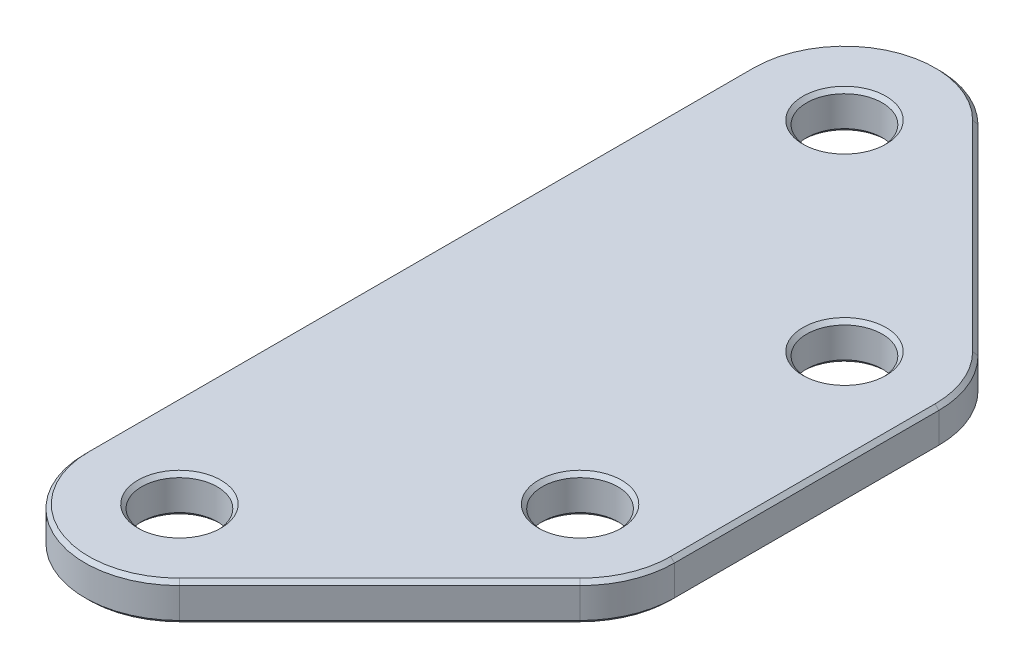
ISO-10303-21;
HEADER;
FILE_DESCRIPTION(('STEP AP214'),'2;1');
FILE_NAME('part.step','',(''),(''),'','','');
FILE_SCHEMA(('AUTOMOTIVE_DESIGN { 1 0 10303 214 1 1 1 1 }'));
ENDSEC;
DATA;
#1=APPLICATION_CONTEXT('core data for automotive mechanical design processes');
#2=APPLICATION_PROTOCOL_DEFINITION('international standard','automotive_design',2000,#1);
#3=PRODUCT_CONTEXT('',#1,'mechanical');
#4=PRODUCT('Part','Part','',(#3));
#5=PRODUCT_RELATED_PRODUCT_CATEGORY('part','',(#4));
#6=PRODUCT_DEFINITION_FORMATION('','',#4);
#7=PRODUCT_DEFINITION_CONTEXT('part definition',#1,'design');
#8=PRODUCT_DEFINITION('design','',#6,#7);
#9=PRODUCT_DEFINITION_SHAPE('','',#8);
#10=(LENGTH_UNIT() NAMED_UNIT(*) SI_UNIT(.MILLI.,.METRE.));
#11=(NAMED_UNIT(*) PLANE_ANGLE_UNIT() SI_UNIT($,.RADIAN.));
#12=(NAMED_UNIT(*) SI_UNIT($,.STERADIAN.) SOLID_ANGLE_UNIT());
#13=UNCERTAINTY_MEASURE_WITH_UNIT(LENGTH_MEASURE(1.E-05),#10,'distance_accuracy_value','');
#14=(GEOMETRIC_REPRESENTATION_CONTEXT(3) GLOBAL_UNCERTAINTY_ASSIGNED_CONTEXT((#13)) GLOBAL_UNIT_ASSIGNED_CONTEXT((#10,
#11,#12)) REPRESENTATION_CONTEXT('',''));
#15=CARTESIAN_POINT('',(0.,0.,0.));
#16=DIRECTION('',(0.,0.,1.));
#17=DIRECTION('',(1.,0.,0.));
#18=AXIS2_PLACEMENT_3D('',#15,#16,#17);
#19=CARTESIAN_POINT('',(-50.,20.,176.066017177983));
#20=DIRECTION('',(0.,1.,0.));
#21=DIRECTION('',(0.,0.,1.));
#22=AXIS2_PLACEMENT_3D('',#19,#20,#21);
#23=PLANE('',#22);
#24=CARTESIAN_POINT('',(-50.,20.,176.066017177982));
#25=DIRECTION('',(0.,1.,0.));
#26=DIRECTION('',(0.,0.,1.));
#27=AXIS2_PLACEMENT_3D('',#24,#25,#26);
#28=CIRCLE('',#27,22.0000000000001);
#29=CARTESIAN_POINT('',(-50.,20.,198.066017177982));
#30=VERTEX_POINT('',#29);
#31=EDGE_CURVE('E11',#30,#30,#28,.F.);
#32=ORIENTED_EDGE('',*,*,#31,.T.);
#33=EDGE_LOOP('',(#32));
#34=FACE_BOUND('',#33,.T.);
#35=CARTESIAN_POINT('',(56.0660171779823,20.,-70.));
#36=DIRECTION('',(0.,1.,0.));
#37=DIRECTION('',(0.,0.,1.));
#38=AXIS2_PLACEMENT_3D('',#35,#36,#37);
#39=CIRCLE('',#38,22.0000000000001);
#40=CARTESIAN_POINT('',(56.0660171779823,20.,-47.9999999999999));
#41=VERTEX_POINT('',#40);
#42=EDGE_CURVE('E50',#41,#41,#39,.F.);
#43=ORIENTED_EDGE('',*,*,#42,.T.);
#44=EDGE_LOOP('',(#43));
#45=FACE_BOUND('',#44,.T.);
#46=CARTESIAN_POINT('',(-50.0000000000001,20.,-176.066017177982));
#47=DIRECTION('',(0.,1.,0.));
#48=DIRECTION('',(0.,0.,1.));
#49=AXIS2_PLACEMENT_3D('',#46,#47,#48);
#50=CIRCLE('',#49,48.0000000000001);
#51=CARTESIAN_POINT('',(-16.0588745030458,20.,-210.007142674936));
#52=VERTEX_POINT('',#51);
#53=CARTESIAN_POINT('',(-98.0000000000002,20.,-176.066017177982));
#54=VERTEX_POINT('',#53);
#55=EDGE_CURVE('E58',#52,#54,#50,.T.);
#56=ORIENTED_EDGE('',*,*,#55,.T.);
#57=DIRECTION('',(0.,0.,1.));
#58=VECTOR('',#57,1.);
#59=CARTESIAN_POINT('',(-98.0000000000001,20.,176.066017177983));
#60=LINE('',#59,#58);
#61=CARTESIAN_POINT('',(-98.0000000000001,20.,176.066017177983));
#62=VERTEX_POINT('',#61);
#63=EDGE_CURVE('E274',#54,#62,#60,.T.);
#64=ORIENTED_EDGE('',*,*,#63,.T.);
#65=CARTESIAN_POINT('',(-50.,20.,176.066017177983));
#66=DIRECTION('',(0.,1.,0.));
#67=DIRECTION('',(0.,0.,1.));
#68=AXIS2_PLACEMENT_3D('',#65,#66,#67);
#69=CIRCLE('',#68,48.0000000000001);
#70=CARTESIAN_POINT('',(-16.0588745030457,20.,210.007142674937));
#71=VERTEX_POINT('',#70);
#72=EDGE_CURVE('E262',#62,#71,#69,.T.);
#73=ORIENTED_EDGE('',*,*,#72,.T.);
#74=DIRECTION('',(0.707106781186548,0.,-0.707106781186547));
#75=VECTOR('',#74,1.);
#76=CARTESIAN_POINT('',(90.0071426749366,20.,103.941125496955));
#77=LINE('',#76,#75);
#78=CARTESIAN_POINT('',(90.0071426749366,20.,103.941125496955));
#79=VERTEX_POINT('',#78);
#80=EDGE_CURVE('E264',#71,#79,#77,.T.);
#81=ORIENTED_EDGE('',*,*,#80,.T.);
#82=CARTESIAN_POINT('',(56.0660171779823,20.,70.0000000000003));
#83=DIRECTION('',(0.,1.,0.));
#84=DIRECTION('',(0.,0.,1.));
#85=AXIS2_PLACEMENT_3D('',#82,#83,#84);
#86=CIRCLE('',#85,48.0000000000001);
#87=CARTESIAN_POINT('',(104.066017177982,20.,70.0000000000003));
#88=VERTEX_POINT('',#87);
#89=EDGE_CURVE('E266',#79,#88,#86,.T.);
#90=ORIENTED_EDGE('',*,*,#89,.T.);
#91=DIRECTION('',(0.,0.,-1.));
#92=VECTOR('',#91,1.);
#93=CARTESIAN_POINT('',(104.066017177982,20.,-69.9999999999998));
#94=LINE('',#93,#92);
#95=CARTESIAN_POINT('',(104.066017177982,20.,-69.9999999999998));
#96=VERTEX_POINT('',#95);
#97=EDGE_CURVE('E268',#88,#96,#94,.T.);
#98=ORIENTED_EDGE('',*,*,#97,.T.);
#99=CARTESIAN_POINT('',(56.0660171779823,20.,-69.9999999999998));
#100=DIRECTION('',(0.,1.,0.));
#101=DIRECTION('',(0.,0.,1.));
#102=AXIS2_PLACEMENT_3D('',#99,#100,#101);
#103=CIRCLE('',#102,48.0000000000001);
#104=CARTESIAN_POINT('',(90.0071426749365,20.,-103.941125496954));
#105=VERTEX_POINT('',#104);
#106=EDGE_CURVE('E270',#96,#105,#103,.T.);
#107=ORIENTED_EDGE('',*,*,#106,.T.);
#108=DIRECTION('',(-0.707106781186549,0.,-0.707106781186546));
#109=VECTOR('',#108,1.);
#110=CARTESIAN_POINT('',(-16.0588745030458,20.,-210.007142674936));
#111=LINE('',#110,#109);
#112=EDGE_CURVE('E63',#105,#52,#111,.T.);
#113=ORIENTED_EDGE('',*,*,#112,.T.);
#114=EDGE_LOOP('',(#56,#64,#73,#81,#90,#98,#107,#113));
#115=FACE_BOUND('',#114,.T.);
#116=CARTESIAN_POINT('',(-50.0000000000001,20.,-176.066017177982));
#117=DIRECTION('',(0.,1.,0.));
#118=DIRECTION('',(0.,0.,1.));
#119=AXIS2_PLACEMENT_3D('',#116,#117,#118);
#120=CIRCLE('',#119,22.0000000000001);
#121=CARTESIAN_POINT('',(-50.0000000000001,20.,-154.066017177982));
#122=VERTEX_POINT('',#121);
#123=EDGE_CURVE('E259',#122,#122,#120,.F.);
#124=ORIENTED_EDGE('',*,*,#123,.T.);
#125=EDGE_LOOP('',(#124));
#126=FACE_BOUND('',#125,.T.);
#127=CARTESIAN_POINT('',(56.0660171779823,20.,70.));
#128=DIRECTION('',(0.,1.,0.));
#129=DIRECTION('',(0.,0.,1.));
#130=AXIS2_PLACEMENT_3D('',#127,#128,#129);
#131=CIRCLE('',#130,22.0000000000001);
#132=CARTESIAN_POINT('',(56.0660171779823,20.,92.0000000000001));
#133=VERTEX_POINT('',#132);
#134=EDGE_CURVE('E256',#133,#133,#131,.F.);
#135=ORIENTED_EDGE('',*,*,#134,.T.);
#136=EDGE_LOOP('',(#135));
#137=FACE_BOUND('',#136,.T.);
#138=ADVANCED_FACE('F40',(#34,#45,#115,#126,#137),#23,.T.);
#139=CARTESIAN_POINT('',(-50.,0.,176.066017177983));
#140=DIRECTION('',(0.,1.,0.));
#141=DIRECTION('',(0.,0.,1.));
#142=AXIS2_PLACEMENT_3D('',#139,#140,#141);
#143=PLANE('',#142);
#144=CARTESIAN_POINT('',(-50.,0.,176.066017177982));
#145=DIRECTION('',(0.,1.,0.));
#146=DIRECTION('',(0.,0.,1.));
#147=AXIS2_PLACEMENT_3D('',#144,#145,#146);
#148=CIRCLE('',#147,22.);
#149=CARTESIAN_POINT('',(-50.,0.,198.066017177982));
#150=VERTEX_POINT('',#149);
#151=EDGE_CURVE('E197',#150,#150,#148,.T.);
#152=ORIENTED_EDGE('',*,*,#151,.T.);
#153=EDGE_LOOP('',(#152));
#154=FACE_BOUND('',#153,.T.);
#155=CARTESIAN_POINT('',(56.0660171779823,0.,70.));
#156=DIRECTION('',(0.,1.,0.));
#157=DIRECTION('',(0.,0.,1.));
#158=AXIS2_PLACEMENT_3D('',#155,#156,#157);
#159=CIRCLE('',#158,22.);
#160=CARTESIAN_POINT('',(56.0660171779823,0.,92.));
#161=VERTEX_POINT('',#160);
#162=EDGE_CURVE('E194',#161,#161,#159,.T.);
#163=ORIENTED_EDGE('',*,*,#162,.T.);
#164=EDGE_LOOP('',(#163));
#165=FACE_BOUND('',#164,.T.);
#166=CARTESIAN_POINT('',(56.0660171779823,0.,-70.));
#167=DIRECTION('',(0.,1.,0.));
#168=DIRECTION('',(0.,0.,1.));
#169=AXIS2_PLACEMENT_3D('',#166,#167,#168);
#170=CIRCLE('',#169,22.);
#171=CARTESIAN_POINT('',(56.0660171779823,0.,-48.));
#172=VERTEX_POINT('',#171);
#173=EDGE_CURVE('E186',#172,#172,#170,.T.);
#174=ORIENTED_EDGE('',*,*,#173,.T.);
#175=EDGE_LOOP('',(#174));
#176=FACE_BOUND('',#175,.T.);
#177=CARTESIAN_POINT('',(-50.0000000000001,0.,-176.066017177982));
#178=DIRECTION('',(0.,1.,0.));
#179=DIRECTION('',(0.,0.,1.));
#180=AXIS2_PLACEMENT_3D('',#177,#178,#179);
#181=CIRCLE('',#180,22.);
#182=CARTESIAN_POINT('',(-50.0000000000001,0.,-154.066017177982));
#183=VERTEX_POINT('',#182);
#184=EDGE_CURVE('E183',#183,#183,#181,.T.);
#185=ORIENTED_EDGE('',*,*,#184,.T.);
#186=EDGE_LOOP('',(#185));
#187=FACE_BOUND('',#186,.T.);
#188=CARTESIAN_POINT('',(56.0660171779823,0.,70.0000000000003));
#189=DIRECTION('',(0.,1.,0.));
#190=DIRECTION('',(0.,0.,1.));
#191=AXIS2_PLACEMENT_3D('',#188,#189,#190);
#192=CIRCLE('',#191,48.);
#193=CARTESIAN_POINT('',(104.066017177982,0.,70.0000000000003));
#194=VERTEX_POINT('',#193);
#195=CARTESIAN_POINT('',(90.0071426749365,0.,103.941125496955));
#196=VERTEX_POINT('',#195);
#197=EDGE_CURVE('E182',#194,#196,#192,.F.);
#198=ORIENTED_EDGE('',*,*,#197,.T.);
#199=DIRECTION('',(-0.707106781186548,0.,0.707106781186547));
#200=VECTOR('',#199,1.);
#201=CARTESIAN_POINT('',(-16.0588745030457,0.,210.007142674937));
#202=LINE('',#201,#200);
#203=CARTESIAN_POINT('',(-16.0588745030457,0.,210.007142674937));
#204=VERTEX_POINT('',#203);
#205=EDGE_CURVE('E161',#196,#204,#202,.T.);
#206=ORIENTED_EDGE('',*,*,#205,.T.);
#207=CARTESIAN_POINT('',(-50.,0.,176.066017177983));
#208=DIRECTION('',(0.,1.,0.));
#209=DIRECTION('',(0.,0.,1.));
#210=AXIS2_PLACEMENT_3D('',#207,#208,#209);
#211=CIRCLE('',#210,48.);
#212=CARTESIAN_POINT('',(-98.,0.,176.066017177983));
#213=VERTEX_POINT('',#212);
#214=EDGE_CURVE('E171',#204,#213,#211,.F.);
#215=ORIENTED_EDGE('',*,*,#214,.T.);
#216=DIRECTION('',(0.,0.,-1.));
#217=VECTOR('',#216,1.);
#218=CARTESIAN_POINT('',(-98.,0.,176.066017177983));
#219=LINE('',#218,#217);
#220=CARTESIAN_POINT('',(-98.,0.,-176.066017177982));
#221=VERTEX_POINT('',#220);
#222=EDGE_CURVE('E177',#213,#221,#219,.T.);
#223=ORIENTED_EDGE('',*,*,#222,.T.);
#224=CARTESIAN_POINT('',(-50.0000000000001,0.,-176.066017177982));
#225=DIRECTION('',(0.,1.,0.));
#226=DIRECTION('',(0.,0.,1.));
#227=AXIS2_PLACEMENT_3D('',#224,#225,#226);
#228=CIRCLE('',#227,48.);
#229=CARTESIAN_POINT('',(-16.0588745030459,0.,-210.007142674936));
#230=VERTEX_POINT('',#229);
#231=EDGE_CURVE('E351',#221,#230,#228,.F.);
#232=ORIENTED_EDGE('',*,*,#231,.T.);
#233=DIRECTION('',(0.707106781186549,0.,0.707106781186546));
#234=VECTOR('',#233,1.);
#235=CARTESIAN_POINT('',(160.007142674936,0.,-33.9411254969546));
#236=LINE('',#235,#234);
#237=CARTESIAN_POINT('',(90.0071426749364,0.,-103.941125496954));
#238=VERTEX_POINT('',#237);
#239=EDGE_CURVE('E353',#230,#238,#236,.T.);
#240=ORIENTED_EDGE('',*,*,#239,.T.);
#241=CARTESIAN_POINT('',(56.0660171779823,0.,-69.9999999999998));
#242=DIRECTION('',(0.,1.,0.));
#243=DIRECTION('',(0.,0.,1.));
#244=AXIS2_PLACEMENT_3D('',#241,#242,#243);
#245=CIRCLE('',#244,48.);
#246=CARTESIAN_POINT('',(104.066017177982,0.,-69.9999999999998));
#247=VERTEX_POINT('',#246);
#248=EDGE_CURVE('E355',#238,#247,#245,.F.);
#249=ORIENTED_EDGE('',*,*,#248,.T.);
#250=DIRECTION('',(0.,0.,1.));
#251=VECTOR('',#250,1.);
#252=CARTESIAN_POINT('',(104.066017177982,0.,176.066017177982));
#253=LINE('',#252,#251);
#254=EDGE_CURVE('E188',#247,#194,#253,.T.);
#255=ORIENTED_EDGE('',*,*,#254,.T.);
#256=EDGE_LOOP('',(#198,#206,#215,#223,#232,#240,#249,#255));
#257=FACE_BOUND('',#256,.T.);
#258=ADVANCED_FACE('F180',(#154,#165,#176,#187,#257),#143,.F.);
#259=CARTESIAN_POINT('',(-50.,20.,176.066017177983));
#260=DIRECTION('',(0.,-1.,0.));
#261=DIRECTION('',(0.,0.,-1.));
#262=AXIS2_PLACEMENT_3D('',#259,#260,#261);
#263=CYLINDRICAL_SURFACE('',#262,50.);
#264=DIRECTION('',(0.,-1.,0.));
#265=VECTOR('',#264,1.);
#266=CARTESIAN_POINT('',(-100.,20.,176.066017177983));
#267=LINE('',#266,#265);
#268=CARTESIAN_POINT('',(-100.,18.0000000000001,176.066017177983));
#269=VERTEX_POINT('',#268);
#270=CARTESIAN_POINT('',(-100.,2.00000000000002,176.066017177983));
#271=VERTEX_POINT('',#270);
#272=EDGE_CURVE('E294',#269,#271,#267,.T.);
#273=ORIENTED_EDGE('',*,*,#272,.T.);
#274=CARTESIAN_POINT('',(-50.,2.00000000000002,176.066017177983));
#275=DIRECTION('',(0.,1.,0.));
#276=DIRECTION('',(0.,0.,1.));
#277=AXIS2_PLACEMENT_3D('',#274,#275,#276);
#278=CIRCLE('',#277,50.);
#279=CARTESIAN_POINT('',(-14.6446609406726,2.00000000000002,211.42135623731));
#280=VERTEX_POINT('',#279);
#281=EDGE_CURVE('E254',#271,#280,#278,.T.);
#282=ORIENTED_EDGE('',*,*,#281,.T.);
#283=DIRECTION('',(0.,-1.,0.));
#284=VECTOR('',#283,1.);
#285=CARTESIAN_POINT('',(-14.6446609406726,20.,211.42135623731));
#286=LINE('',#285,#284);
#287=CARTESIAN_POINT('',(-14.6446609406726,18.0000000000001,211.42135623731));
#288=VERTEX_POINT('',#287);
#289=EDGE_CURVE('E178',#288,#280,#286,.T.);
#290=ORIENTED_EDGE('',*,*,#289,.F.);
#291=CARTESIAN_POINT('',(-50.,18.0000000000001,176.066017177983));
#292=DIRECTION('',(0.,1.,0.));
#293=DIRECTION('',(0.,0.,1.));
#294=AXIS2_PLACEMENT_3D('',#291,#292,#293);
#295=CIRCLE('',#294,50.);
#296=EDGE_CURVE('E252',#288,#269,#295,.F.);
#297=ORIENTED_EDGE('',*,*,#296,.T.);
#298=EDGE_LOOP('',(#273,#282,#290,#297));
#299=FACE_BOUND('',#298,.T.);
#300=ADVANCED_FACE('F372',(#299),#263,.T.);
#301=CARTESIAN_POINT('',(-14.6446609406726,20.,211.42135623731));
#302=DIRECTION('',(-0.707106781186547,0.,-0.707106781186548));
#303=DIRECTION('',(-0.707106781186548,0.,0.707106781186547));
#304=AXIS2_PLACEMENT_3D('',#301,#302,#303);
#305=PLANE('',#304);
#306=ORIENTED_EDGE('',*,*,#289,.T.);
#307=DIRECTION('',(0.707106781186548,0.,-0.707106781186547));
#308=VECTOR('',#307,1.);
#309=CARTESIAN_POINT('',(-14.6446609406726,2.00000000000002,211.42135623731));
#310=LINE('',#309,#308);
#311=CARTESIAN_POINT('',(91.4213562373096,2.00000000000002,105.355339059328));
#312=VERTEX_POINT('',#311);
#313=EDGE_CURVE('E164',#280,#312,#310,.T.);
#314=ORIENTED_EDGE('',*,*,#313,.T.);
#315=DIRECTION('',(0.,-1.,0.));
#316=VECTOR('',#315,1.);
#317=CARTESIAN_POINT('',(91.4213562373096,20.,105.355339059328));
#318=LINE('',#317,#316);
#319=CARTESIAN_POINT('',(91.4213562373096,18.0000000000001,105.355339059328));
#320=VERTEX_POINT('',#319);
#321=EDGE_CURVE('E341',#320,#312,#318,.T.);
#322=ORIENTED_EDGE('',*,*,#321,.F.);
#323=DIRECTION('',(-0.707106781186548,0.,0.707106781186547));
#324=VECTOR('',#323,1.);
#325=CARTESIAN_POINT('',(-14.6446609406726,18.0000000000001,211.42135623731));
#326=LINE('',#325,#324);
#327=EDGE_CURVE('E224',#320,#288,#326,.T.);
#328=ORIENTED_EDGE('',*,*,#327,.T.);
#329=EDGE_LOOP('',(#306,#314,#322,#328));
#330=FACE_BOUND('',#329,.T.);
#331=ADVANCED_FACE('F365',(#330),#305,.F.);
#332=CARTESIAN_POINT('',(56.0660171779823,20.,70.0000000000003));
#333=DIRECTION('',(0.,-1.,0.));
#334=DIRECTION('',(0.,0.,-1.));
#335=AXIS2_PLACEMENT_3D('',#332,#333,#334);
#336=CYLINDRICAL_SURFACE('',#335,50.);
#337=ORIENTED_EDGE('',*,*,#321,.T.);
#338=CARTESIAN_POINT('',(56.0660171779823,2.00000000000002,70.0000000000003));
#339=DIRECTION('',(0.,1.,0.));
#340=DIRECTION('',(0.,0.,1.));
#341=AXIS2_PLACEMENT_3D('',#338,#339,#340);
#342=CIRCLE('',#341,50.);
#343=CARTESIAN_POINT('',(106.066017177982,2.00000000000002,70.0000000000003));
#344=VERTEX_POINT('',#343);
#345=EDGE_CURVE('E229',#312,#344,#342,.T.);
#346=ORIENTED_EDGE('',*,*,#345,.T.);
#347=DIRECTION('',(0.,-1.,0.));
#348=VECTOR('',#347,1.);
#349=CARTESIAN_POINT('',(106.066017177982,20.,70.0000000000003));
#350=LINE('',#349,#348);
#351=CARTESIAN_POINT('',(106.066017177982,18.0000000000001,70.0000000000003));
#352=VERTEX_POINT('',#351);
#353=EDGE_CURVE('E332',#352,#344,#350,.T.);
#354=ORIENTED_EDGE('',*,*,#353,.F.);
#355=CARTESIAN_POINT('',(56.0660171779823,18.0000000000001,70.0000000000003));
#356=DIRECTION('',(0.,1.,0.));
#357=DIRECTION('',(0.,0.,1.));
#358=AXIS2_PLACEMENT_3D('',#355,#356,#357);
#359=CIRCLE('',#358,50.);
#360=EDGE_CURVE('E227',#352,#320,#359,.F.);
#361=ORIENTED_EDGE('',*,*,#360,.T.);
#362=EDGE_LOOP('',(#337,#346,#354,#361));
#363=FACE_BOUND('',#362,.T.);
#364=ADVANCED_FACE('F338',(#363),#336,.T.);
#365=CARTESIAN_POINT('',(106.066017177982,20.,70.0000000000003));
#366=DIRECTION('',(-1.,0.,0.));
#367=DIRECTION('',(0.,0.,1.));
#368=AXIS2_PLACEMENT_3D('',#365,#366,#367);
#369=PLANE('',#368);
#370=ORIENTED_EDGE('',*,*,#353,.T.);
#371=DIRECTION('',(0.,0.,-1.));
#372=VECTOR('',#371,1.);
#373=CARTESIAN_POINT('',(106.066017177982,2.00000000000002,70.0000000000003));
#374=LINE('',#373,#372);
#375=CARTESIAN_POINT('',(106.066017177982,2.00000000000002,-69.9999999999998));
#376=VERTEX_POINT('',#375);
#377=EDGE_CURVE('E233',#344,#376,#374,.T.);
#378=ORIENTED_EDGE('',*,*,#377,.T.);
#379=DIRECTION('',(0.,-1.,0.));
#380=VECTOR('',#379,1.);
#381=CARTESIAN_POINT('',(106.066017177982,20.,-69.9999999999998));
#382=LINE('',#381,#380);
#383=CARTESIAN_POINT('',(106.066017177982,18.0000000000001,-69.9999999999998));
#384=VERTEX_POINT('',#383);
#385=EDGE_CURVE('E335',#384,#376,#382,.T.);
#386=ORIENTED_EDGE('',*,*,#385,.F.);
#387=DIRECTION('',(0.,0.,1.));
#388=VECTOR('',#387,1.);
#389=CARTESIAN_POINT('',(106.066017177982,18.0000000000001,70.0000000000003));
#390=LINE('',#389,#388);
#391=EDGE_CURVE('E231',#384,#352,#390,.T.);
#392=ORIENTED_EDGE('',*,*,#391,.T.);
#393=EDGE_LOOP('',(#370,#378,#386,#392));
#394=FACE_BOUND('',#393,.T.);
#395=ADVANCED_FACE('F331',(#394),#369,.F.);
#396=CARTESIAN_POINT('',(56.0660171779823,20.,-69.9999999999998));
#397=DIRECTION('',(0.,-1.,0.));
#398=DIRECTION('',(0.,0.,-1.));
#399=AXIS2_PLACEMENT_3D('',#396,#397,#398);
#400=CYLINDRICAL_SURFACE('',#399,50.);
#401=ORIENTED_EDGE('',*,*,#385,.T.);
#402=CARTESIAN_POINT('',(56.0660171779823,2.00000000000002,-69.9999999999998));
#403=DIRECTION('',(0.,1.,0.));
#404=DIRECTION('',(0.,0.,1.));
#405=AXIS2_PLACEMENT_3D('',#402,#403,#404);
#406=CIRCLE('',#405,50.);
#407=CARTESIAN_POINT('',(91.4213562373096,2.00000000000001,-105.355339059327));
#408=VERTEX_POINT('',#407);
#409=EDGE_CURVE('E237',#376,#408,#406,.T.);
#410=ORIENTED_EDGE('',*,*,#409,.T.);
#411=DIRECTION('',(0.,-1.,0.));
#412=VECTOR('',#411,1.);
#413=CARTESIAN_POINT('',(91.4213562373096,20.,-105.355339059327));
#414=LINE('',#413,#412);
#415=CARTESIAN_POINT('',(91.4213562373096,18.0000000000001,-105.355339059327));
#416=VERTEX_POINT('',#415);
#417=EDGE_CURVE('E344',#416,#408,#414,.T.);
#418=ORIENTED_EDGE('',*,*,#417,.F.);
#419=CARTESIAN_POINT('',(56.0660171779823,18.0000000000001,-69.9999999999998));
#420=DIRECTION('',(0.,1.,0.));
#421=DIRECTION('',(0.,0.,1.));
#422=AXIS2_PLACEMENT_3D('',#419,#420,#421);
#423=CIRCLE('',#422,50.);
#424=EDGE_CURVE('E235',#416,#384,#423,.F.);
#425=ORIENTED_EDGE('',*,*,#424,.T.);
#426=EDGE_LOOP('',(#401,#410,#418,#425));
#427=FACE_BOUND('',#426,.T.);
#428=ADVANCED_FACE('F417',(#427),#400,.T.);
#429=CARTESIAN_POINT('',(91.4213562373096,20.,-105.355339059327));
#430=DIRECTION('',(-0.707106781186546,0.,0.707106781186549));
#431=DIRECTION('',(0.707106781186549,0.,0.707106781186546));
#432=AXIS2_PLACEMENT_3D('',#429,#430,#431);
#433=PLANE('',#432);
#434=ORIENTED_EDGE('',*,*,#417,.T.);
#435=DIRECTION('',(-0.707106781186549,0.,-0.707106781186546));
#436=VECTOR('',#435,1.);
#437=CARTESIAN_POINT('',(91.4213562373096,2.00000000000001,-105.355339059327));
#438=LINE('',#437,#436);
#439=CARTESIAN_POINT('',(-14.6446609406727,2.00000000000002,-211.421356237309));
#440=VERTEX_POINT('',#439);
#441=EDGE_CURVE('E241',#408,#440,#438,.T.);
#442=ORIENTED_EDGE('',*,*,#441,.T.);
#443=DIRECTION('',(0.,-1.,0.));
#444=VECTOR('',#443,1.);
#445=CARTESIAN_POINT('',(-14.6446609406727,20.,-211.421356237309));
#446=LINE('',#445,#444);
#447=CARTESIAN_POINT('',(-14.6446609406727,18.0000000000001,-211.421356237309));
#448=VERTEX_POINT('',#447);
#449=EDGE_CURVE('E398',#448,#440,#446,.T.);
#450=ORIENTED_EDGE('',*,*,#449,.F.);
#451=DIRECTION('',(0.707106781186549,0.,0.707106781186546));
#452=VECTOR('',#451,1.);
#453=CARTESIAN_POINT('',(91.4213562373096,18.0000000000001,-105.355339059327));
#454=LINE('',#453,#452);
#455=EDGE_CURVE('E239',#448,#416,#454,.T.);
#456=ORIENTED_EDGE('',*,*,#455,.T.);
#457=EDGE_LOOP('',(#434,#442,#450,#456));
#458=FACE_BOUND('',#457,.T.);
#459=ADVANCED_FACE('F406',(#458),#433,.F.);
#460=CARTESIAN_POINT('',(-50.0000000000001,20.,-176.066017177982));
#461=DIRECTION('',(0.,-1.,0.));
#462=DIRECTION('',(0.,0.,-1.));
#463=AXIS2_PLACEMENT_3D('',#460,#461,#462);
#464=CYLINDRICAL_SURFACE('',#463,50.);
#465=ORIENTED_EDGE('',*,*,#449,.T.);
#466=CARTESIAN_POINT('',(-50.0000000000001,2.00000000000002,-176.066017177982));
#467=DIRECTION('',(0.,1.,0.));
#468=DIRECTION('',(0.,0.,1.));
#469=AXIS2_PLACEMENT_3D('',#466,#467,#468);
#470=CIRCLE('',#469,50.);
#471=CARTESIAN_POINT('',(-100.,2.00000000000002,-176.066017177982));
#472=VERTEX_POINT('',#471);
#473=EDGE_CURVE('E245',#440,#472,#470,.T.);
#474=ORIENTED_EDGE('',*,*,#473,.T.);
#475=DIRECTION('',(0.,-1.,0.));
#476=VECTOR('',#475,1.);
#477=CARTESIAN_POINT('',(-100.,20.,-176.066017177982));
#478=LINE('',#477,#476);
#479=CARTESIAN_POINT('',(-100.,18.0000000000001,-176.066017177982));
#480=VERTEX_POINT('',#479);
#481=EDGE_CURVE('E391',#480,#472,#478,.T.);
#482=ORIENTED_EDGE('',*,*,#481,.F.);
#483=CARTESIAN_POINT('',(-50.0000000000001,18.0000000000001,-176.066017177982));
#484=DIRECTION('',(0.,1.,0.));
#485=DIRECTION('',(0.,0.,1.));
#486=AXIS2_PLACEMENT_3D('',#483,#484,#485);
#487=CIRCLE('',#486,50.);
#488=EDGE_CURVE('E243',#480,#448,#487,.F.);
#489=ORIENTED_EDGE('',*,*,#488,.T.);
#490=EDGE_LOOP('',(#465,#474,#482,#489));
#491=FACE_BOUND('',#490,.T.);
#492=ADVANCED_FACE('F395',(#491),#464,.T.);
#493=CARTESIAN_POINT('',(-100.,20.,-176.066017177982));
#494=DIRECTION('',(1.,0.,0.));
#495=DIRECTION('',(0.,0.,-1.));
#496=AXIS2_PLACEMENT_3D('',#493,#494,#495);
#497=PLANE('',#496);
#498=ORIENTED_EDGE('',*,*,#481,.T.);
#499=DIRECTION('',(0.,0.,1.));
#500=VECTOR('',#499,1.);
#501=CARTESIAN_POINT('',(-100.,2.00000000000002,-176.066017177982));
#502=LINE('',#501,#500);
#503=EDGE_CURVE('E250',#472,#271,#502,.T.);
#504=ORIENTED_EDGE('',*,*,#503,.T.);
#505=ORIENTED_EDGE('',*,*,#272,.F.);
#506=DIRECTION('',(0.,0.,-1.));
#507=VECTOR('',#506,1.);
#508=CARTESIAN_POINT('',(-100.,18.0000000000001,-176.066017177982));
#509=LINE('',#508,#507);
#510=EDGE_CURVE('E247',#269,#480,#509,.T.);
#511=ORIENTED_EDGE('',*,*,#510,.T.);
#512=EDGE_LOOP('',(#498,#504,#505,#511));
#513=FACE_BOUND('',#512,.T.);
#514=ADVANCED_FACE('F390',(#513),#497,.F.);
#515=CARTESIAN_POINT('',(-50.0000000000001,20.,-176.066017177982));
#516=DIRECTION('',(0.,-1.,0.));
#517=DIRECTION('',(0.,0.,-1.));
#518=AXIS2_PLACEMENT_3D('',#515,#516,#517);
#519=CYLINDRICAL_SURFACE('',#518,20.);
#520=CARTESIAN_POINT('',(-50.0000000000001,2.,-176.066017177982));
#521=DIRECTION('',(0.,1.,0.));
#522=DIRECTION('',(0.,0.,1.));
#523=AXIS2_PLACEMENT_3D('',#520,#521,#522);
#524=CIRCLE('',#523,20.);
#525=CARTESIAN_POINT('',(-50.0000000000001,2.,-156.066017177982));
#526=VERTEX_POINT('',#525);
#527=EDGE_CURVE('E221',#526,#526,#524,.F.);
#528=ORIENTED_EDGE('',*,*,#527,.T.);
#529=EDGE_LOOP('',(#528));
#530=FACE_BOUND('',#529,.T.);
#531=CARTESIAN_POINT('',(-50.0000000000001,18.,-176.066017177982));
#532=DIRECTION('',(0.,1.,0.));
#533=DIRECTION('',(0.,0.,1.));
#534=AXIS2_PLACEMENT_3D('',#531,#532,#533);
#535=CIRCLE('',#534,20.);
#536=CARTESIAN_POINT('',(-50.0000000000001,18.,-156.066017177982));
#537=VERTEX_POINT('',#536);
#538=EDGE_CURVE('E218',#537,#537,#535,.T.);
#539=ORIENTED_EDGE('',*,*,#538,.T.);
#540=EDGE_LOOP('',(#539));
#541=FACE_BOUND('',#540,.T.);
#542=ADVANCED_FACE('F436',(#530,#541),#519,.F.);
#543=CARTESIAN_POINT('',(56.0660171779823,20.,-70.));
#544=DIRECTION('',(0.,-1.,0.));
#545=DIRECTION('',(0.,0.,-1.));
#546=AXIS2_PLACEMENT_3D('',#543,#544,#545);
#547=CYLINDRICAL_SURFACE('',#546,20.);
#548=CARTESIAN_POINT('',(56.0660171779823,2.00000000000003,-70.));
#549=DIRECTION('',(0.,1.,0.));
#550=DIRECTION('',(0.,0.,1.));
#551=AXIS2_PLACEMENT_3D('',#548,#549,#550);
#552=CIRCLE('',#551,20.);
#553=CARTESIAN_POINT('',(56.0660171779823,2.00000000000003,-50.));
#554=VERTEX_POINT('',#553);
#555=EDGE_CURVE('E215',#554,#554,#552,.F.);
#556=ORIENTED_EDGE('',*,*,#555,.T.);
#557=EDGE_LOOP('',(#556));
#558=FACE_BOUND('',#557,.T.);
#559=CARTESIAN_POINT('',(56.0660171779823,18.,-70.));
#560=DIRECTION('',(0.,1.,0.));
#561=DIRECTION('',(0.,0.,1.));
#562=AXIS2_PLACEMENT_3D('',#559,#560,#561);
#563=CIRCLE('',#562,20.);
#564=CARTESIAN_POINT('',(56.0660171779823,18.,-50.));
#565=VERTEX_POINT('',#564);
#566=EDGE_CURVE('E212',#565,#565,#563,.T.);
#567=ORIENTED_EDGE('',*,*,#566,.T.);
#568=EDGE_LOOP('',(#567));
#569=FACE_BOUND('',#568,.T.);
#570=ADVANCED_FACE('F456',(#558,#569),#547,.F.);
#571=CARTESIAN_POINT('',(56.0660171779823,20.,70.));
#572=DIRECTION('',(0.,-1.,0.));
#573=DIRECTION('',(0.,0.,-1.));
#574=AXIS2_PLACEMENT_3D('',#571,#572,#573);
#575=CYLINDRICAL_SURFACE('',#574,20.);
#576=CARTESIAN_POINT('',(56.0660171779823,2.00000000000002,70.));
#577=DIRECTION('',(0.,1.,0.));
#578=DIRECTION('',(0.,0.,1.));
#579=AXIS2_PLACEMENT_3D('',#576,#577,#578);
#580=CIRCLE('',#579,20.);
#581=CARTESIAN_POINT('',(56.0660171779823,2.00000000000002,90.));
#582=VERTEX_POINT('',#581);
#583=EDGE_CURVE('E209',#582,#582,#580,.F.);
#584=ORIENTED_EDGE('',*,*,#583,.T.);
#585=EDGE_LOOP('',(#584));
#586=FACE_BOUND('',#585,.T.);
#587=CARTESIAN_POINT('',(56.0660171779823,18.,70.));
#588=DIRECTION('',(0.,1.,0.));
#589=DIRECTION('',(0.,0.,1.));
#590=AXIS2_PLACEMENT_3D('',#587,#588,#589);
#591=CIRCLE('',#590,20.);
#592=CARTESIAN_POINT('',(56.0660171779823,18.,90.));
#593=VERTEX_POINT('',#592);
#594=EDGE_CURVE('E206',#593,#593,#591,.T.);
#595=ORIENTED_EDGE('',*,*,#594,.T.);
#596=EDGE_LOOP('',(#595));
#597=FACE_BOUND('',#596,.T.);
#598=ADVANCED_FACE('F463',(#586,#597),#575,.F.);
#599=CARTESIAN_POINT('',(-50.,20.,176.066017177982));
#600=DIRECTION('',(0.,-1.,0.));
#601=DIRECTION('',(0.,0.,-1.));
#602=AXIS2_PLACEMENT_3D('',#599,#600,#601);
#603=CYLINDRICAL_SURFACE('',#602,20.);
#604=CARTESIAN_POINT('',(-50.,2.,176.066017177982));
#605=DIRECTION('',(0.,1.,0.));
#606=DIRECTION('',(0.,0.,1.));
#607=AXIS2_PLACEMENT_3D('',#604,#605,#606);
#608=CIRCLE('',#607,20.);
#609=CARTESIAN_POINT('',(-50.,2.,196.066017177982));
#610=VERTEX_POINT('',#609);
#611=EDGE_CURVE('E203',#610,#610,#608,.F.);
#612=ORIENTED_EDGE('',*,*,#611,.T.);
#613=EDGE_LOOP('',(#612));
#614=FACE_BOUND('',#613,.T.);
#615=CARTESIAN_POINT('',(-50.,18.,176.066017177982));
#616=DIRECTION('',(0.,1.,0.));
#617=DIRECTION('',(0.,0.,1.));
#618=AXIS2_PLACEMENT_3D('',#615,#616,#617);
#619=CIRCLE('',#618,20.);
#620=CARTESIAN_POINT('',(-50.,18.,196.066017177982));
#621=VERTEX_POINT('',#620);
#622=EDGE_CURVE('E200',#621,#621,#619,.T.);
#623=ORIENTED_EDGE('',*,*,#622,.T.);
#624=EDGE_LOOP('',(#623));
#625=FACE_BOUND('',#624,.T.);
#626=ADVANCED_FACE('F470',(#614,#625),#603,.F.);
#627=CARTESIAN_POINT('',(-50.,0.,176.066017177982));
#628=DIRECTION('',(0.,-1.,0.));
#629=DIRECTION('',(0.,0.,-1.));
#630=AXIS2_PLACEMENT_3D('',#627,#628,#629);
#631=CONICAL_SURFACE('',#630,22.,0.785398163397445);
#632=ORIENTED_EDGE('',*,*,#611,.F.);
#633=EDGE_LOOP('',(#632));
#634=FACE_BOUND('',#633,.T.);
#635=ORIENTED_EDGE('',*,*,#151,.F.);
#636=EDGE_LOOP('',(#635));
#637=FACE_BOUND('',#636,.T.);
#638=ADVANCED_FACE('F478',(#634,#637),#631,.F.);
#639=CARTESIAN_POINT('',(56.0660171779823,0.,70.));
#640=DIRECTION('',(0.,-1.,0.));
#641=DIRECTION('',(0.,0.,-1.));
#642=AXIS2_PLACEMENT_3D('',#639,#640,#641);
#643=CONICAL_SURFACE('',#642,22.,0.785398163397438);
#644=ORIENTED_EDGE('',*,*,#583,.F.);
#645=EDGE_LOOP('',(#644));
#646=FACE_BOUND('',#645,.T.);
#647=ORIENTED_EDGE('',*,*,#162,.F.);
#648=EDGE_LOOP('',(#647));
#649=FACE_BOUND('',#648,.T.);
#650=ADVANCED_FACE('F486',(#646,#649),#643,.F.);
#651=CARTESIAN_POINT('',(56.0660171779823,0.,-70.));
#652=DIRECTION('',(0.,-1.,0.));
#653=DIRECTION('',(0.,0.,-1.));
#654=AXIS2_PLACEMENT_3D('',#651,#652,#653);
#655=CONICAL_SURFACE('',#654,22.,0.785398163397431);
#656=ORIENTED_EDGE('',*,*,#555,.F.);
#657=EDGE_LOOP('',(#656));
#658=FACE_BOUND('',#657,.T.);
#659=ORIENTED_EDGE('',*,*,#173,.F.);
#660=EDGE_LOOP('',(#659));
#661=FACE_BOUND('',#660,.T.);
#662=ADVANCED_FACE('F494',(#658,#661),#655,.F.);
#663=CARTESIAN_POINT('',(-50.0000000000001,0.,-176.066017177982));
#664=DIRECTION('',(0.,-1.,0.));
#665=DIRECTION('',(0.,0.,-1.));
#666=AXIS2_PLACEMENT_3D('',#663,#664,#665);
#667=CONICAL_SURFACE('',#666,22.,0.785398163397445);
#668=ORIENTED_EDGE('',*,*,#527,.F.);
#669=EDGE_LOOP('',(#668));
#670=FACE_BOUND('',#669,.T.);
#671=ORIENTED_EDGE('',*,*,#184,.F.);
#672=EDGE_LOOP('',(#671));
#673=FACE_BOUND('',#672,.T.);
#674=ADVANCED_FACE('F502',(#670,#673),#667,.F.);
#675=CARTESIAN_POINT('',(91.4213562373096,2.00000000000002,-105.355339059327));
#676=DIRECTION('',(-0.499999999999997,0.70710678118655,0.499999999999999));
#677=DIRECTION('',(-0.707106781186549,0.,-0.707106781186546));
#678=AXIS2_PLACEMENT_3D('',#675,#676,#677);
#679=PLANE('',#678);
#680=DIRECTION('',(0.500000000000003,0.707106781186543,-0.500000000000003));
#681=VECTOR('',#680,1.);
#682=CARTESIAN_POINT('',(90.0071426749364,0.,-103.941125496954));
#683=LINE('',#682,#681);
#684=EDGE_CURVE('E288',#238,#408,#683,.T.);
#685=ORIENTED_EDGE('',*,*,#684,.F.);
#686=ORIENTED_EDGE('',*,*,#239,.F.);
#687=DIRECTION('',(-0.500000000000003,-0.707106781186543,0.500000000000003));
#688=VECTOR('',#687,1.);
#689=CARTESIAN_POINT('',(-14.6446609406727,2.00000000000001,-211.421356237309));
#690=LINE('',#689,#688);
#691=EDGE_CURVE('E291',#440,#230,#690,.T.);
#692=ORIENTED_EDGE('',*,*,#691,.F.);
#693=ORIENTED_EDGE('',*,*,#441,.F.);
#694=EDGE_LOOP('',(#685,#686,#692,#693));
#695=FACE_BOUND('',#694,.T.);
#696=ADVANCED_FACE('F412',(#695),#679,.F.);
#697=CARTESIAN_POINT('',(-50.0000000000001,2.00000000000002,-176.066017177982));
#698=DIRECTION('',(0.,1.,0.));
#699=DIRECTION('',(0.,0.,1.));
#700=AXIS2_PLACEMENT_3D('',#697,#698,#699);
#701=CONICAL_SURFACE('',#700,50.,0.785398163397453);
#702=ORIENTED_EDGE('',*,*,#691,.T.);
#703=ORIENTED_EDGE('',*,*,#231,.F.);
#704=DIRECTION('',(0.70710678118655,-0.707106781186545,0.));
#705=VECTOR('',#704,1.);
#706=CARTESIAN_POINT('',(-100.,2.00000000000002,-176.066017177982));
#707=LINE('',#706,#705);
#708=EDGE_CURVE('E285',#472,#221,#707,.T.);
#709=ORIENTED_EDGE('',*,*,#708,.F.);
#710=ORIENTED_EDGE('',*,*,#473,.F.);
#711=EDGE_LOOP('',(#702,#703,#709,#710));
#712=FACE_BOUND('',#711,.T.);
#713=ADVANCED_FACE('F517',(#712),#701,.T.);
#714=CARTESIAN_POINT('',(56.0660171779823,2.00000000000002,-69.9999999999998));
#715=DIRECTION('',(0.,1.,0.));
#716=DIRECTION('',(0.,0.,1.));
#717=AXIS2_PLACEMENT_3D('',#714,#715,#716);
#718=CONICAL_SURFACE('',#717,50.,0.785398163397452);
#719=ORIENTED_EDGE('',*,*,#684,.T.);
#720=ORIENTED_EDGE('',*,*,#409,.F.);
#721=DIRECTION('',(0.70710678118655,0.707106781186545,0.));
#722=VECTOR('',#721,1.);
#723=CARTESIAN_POINT('',(104.066017177982,0.,-69.9999999999998));
#724=LINE('',#723,#722);
#725=EDGE_CURVE('E282',#247,#376,#724,.T.);
#726=ORIENTED_EDGE('',*,*,#725,.F.);
#727=ORIENTED_EDGE('',*,*,#248,.F.);
#728=EDGE_LOOP('',(#719,#720,#726,#727));
#729=FACE_BOUND('',#728,.T.);
#730=ADVANCED_FACE('F416',(#729),#718,.T.);
#731=CARTESIAN_POINT('',(-100.,2.00000000000002,-176.066017177982));
#732=DIRECTION('',(0.707106781186545,0.70710678118655,0.));
#733=DIRECTION('',(0.,0.,1.));
#734=AXIS2_PLACEMENT_3D('',#731,#732,#733);
#735=PLANE('',#734);
#736=ORIENTED_EDGE('',*,*,#708,.T.);
#737=ORIENTED_EDGE('',*,*,#222,.F.);
#738=DIRECTION('',(0.70710678118655,-0.707106781186545,0.));
#739=VECTOR('',#738,1.);
#740=CARTESIAN_POINT('',(-100.,2.00000000000002,176.066017177983));
#741=LINE('',#740,#739);
#742=EDGE_CURVE('E174',#271,#213,#741,.T.);
#743=ORIENTED_EDGE('',*,*,#742,.F.);
#744=ORIENTED_EDGE('',*,*,#503,.F.);
#745=EDGE_LOOP('',(#736,#737,#743,#744));
#746=FACE_BOUND('',#745,.T.);
#747=ADVANCED_FACE('F531',(#746),#735,.F.);
#748=CARTESIAN_POINT('',(106.066017177982,2.00000000000002,70.0000000000003));
#749=DIRECTION('',(-0.707106781186543,0.707106781186552,0.));
#750=DIRECTION('',(0.,0.,-1.));
#751=AXIS2_PLACEMENT_3D('',#748,#749,#750);
#752=PLANE('',#751);
#753=ORIENTED_EDGE('',*,*,#725,.T.);
#754=ORIENTED_EDGE('',*,*,#377,.F.);
#755=DIRECTION('',(0.707106781186552,0.707106781186543,0.));
#756=VECTOR('',#755,1.);
#757=CARTESIAN_POINT('',(104.066017177982,0.,70.0000000000003));
#758=LINE('',#757,#756);
#759=EDGE_CURVE('E167',#194,#344,#758,.T.);
#760=ORIENTED_EDGE('',*,*,#759,.F.);
#761=ORIENTED_EDGE('',*,*,#254,.F.);
#762=EDGE_LOOP('',(#753,#754,#760,#761));
#763=FACE_BOUND('',#762,.T.);
#764=ADVANCED_FACE('F361',(#763),#752,.F.);
#765=CARTESIAN_POINT('',(-50.,2.00000000000002,176.066017177983));
#766=DIRECTION('',(0.,1.,0.));
#767=DIRECTION('',(0.,0.,1.));
#768=AXIS2_PLACEMENT_3D('',#765,#766,#767);
#769=CONICAL_SURFACE('',#768,50.,0.785398163397452);
#770=ORIENTED_EDGE('',*,*,#742,.T.);
#771=ORIENTED_EDGE('',*,*,#214,.F.);
#772=DIRECTION('',(-0.500000000000003,-0.707106781186544,-0.500000000000002));
#773=VECTOR('',#772,1.);
#774=CARTESIAN_POINT('',(-14.6446609406726,2.00000000000002,211.42135623731));
#775=LINE('',#774,#773);
#776=EDGE_CURVE('E157',#280,#204,#775,.T.);
#777=ORIENTED_EDGE('',*,*,#776,.F.);
#778=ORIENTED_EDGE('',*,*,#281,.F.);
#779=EDGE_LOOP('',(#770,#771,#777,#778));
#780=FACE_BOUND('',#779,.T.);
#781=ADVANCED_FACE('F172',(#780),#769,.T.);
#782=CARTESIAN_POINT('',(56.0660171779823,2.00000000000002,70.0000000000003));
#783=DIRECTION('',(0.,1.,0.));
#784=DIRECTION('',(0.,0.,1.));
#785=AXIS2_PLACEMENT_3D('',#782,#783,#784);
#786=CONICAL_SURFACE('',#785,50.,0.785398163397453);
#787=ORIENTED_EDGE('',*,*,#759,.T.);
#788=ORIENTED_EDGE('',*,*,#345,.F.);
#789=DIRECTION('',(0.500000000000002,0.707106781186545,0.500000000000002));
#790=VECTOR('',#789,1.);
#791=CARTESIAN_POINT('',(90.0071426749365,0.,103.941125496955));
#792=LINE('',#791,#790);
#793=EDGE_CURVE('E168',#196,#312,#792,.T.);
#794=ORIENTED_EDGE('',*,*,#793,.F.);
#795=ORIENTED_EDGE('',*,*,#197,.F.);
#796=EDGE_LOOP('',(#787,#788,#794,#795));
#797=FACE_BOUND('',#796,.T.);
#798=ADVANCED_FACE('F363',(#797),#786,.T.);
#799=CARTESIAN_POINT('',(-14.6446609406726,2.00000000000002,211.42135623731));
#800=DIRECTION('',(-0.499999999999999,0.707106781186549,-0.499999999999999));
#801=DIRECTION('',(0.707106781186548,0.,-0.707106781186547));
#802=AXIS2_PLACEMENT_3D('',#799,#800,#801);
#803=PLANE('',#802);
#804=ORIENTED_EDGE('',*,*,#776,.T.);
#805=ORIENTED_EDGE('',*,*,#205,.F.);
#806=ORIENTED_EDGE('',*,*,#793,.T.);
#807=ORIENTED_EDGE('',*,*,#313,.F.);
#808=EDGE_LOOP('',(#804,#805,#806,#807));
#809=FACE_BOUND('',#808,.T.);
#810=ADVANCED_FACE('F159',(#809),#803,.F.);
#811=CARTESIAN_POINT('',(-50.,18.,176.066017177982));
#812=DIRECTION('',(0.,1.,0.));
#813=DIRECTION('',(0.,0.,1.));
#814=AXIS2_PLACEMENT_3D('',#811,#812,#813);
#815=CONICAL_SURFACE('',#814,20.,0.785398163397459);
#816=ORIENTED_EDGE('',*,*,#31,.F.);
#817=EDGE_LOOP('',(#816));
#818=FACE_BOUND('',#817,.T.);
#819=ORIENTED_EDGE('',*,*,#622,.F.);
#820=EDGE_LOOP('',(#819));
#821=FACE_BOUND('',#820,.T.);
#822=ADVANCED_FACE('F563',(#818,#821),#815,.F.);
#823=CARTESIAN_POINT('',(56.0660171779823,18.,-70.));
#824=DIRECTION('',(0.,1.,0.));
#825=DIRECTION('',(0.,0.,1.));
#826=AXIS2_PLACEMENT_3D('',#823,#824,#825);
#827=CONICAL_SURFACE('',#826,20.,0.785398163397459);
#828=ORIENTED_EDGE('',*,*,#42,.F.);
#829=EDGE_LOOP('',(#828));
#830=FACE_BOUND('',#829,.T.);
#831=ORIENTED_EDGE('',*,*,#566,.F.);
#832=EDGE_LOOP('',(#831));
#833=FACE_BOUND('',#832,.T.);
#834=ADVANCED_FACE('F570',(#830,#833),#827,.F.);
#835=CARTESIAN_POINT('',(104.066017177982,20.,176.066017177982));
#836=DIRECTION('',(0.707106781186536,0.707106781186559,0.));
#837=DIRECTION('',(0.,0.,1.));
#838=AXIS2_PLACEMENT_3D('',#835,#836,#837);
#839=PLANE('',#838);
#840=DIRECTION('',(-0.70710678118656,0.707106781186535,0.));
#841=VECTOR('',#840,1.);
#842=CARTESIAN_POINT('',(106.066017177982,18.0000000000001,70.0000000000003));
#843=LINE('',#842,#841);
#844=EDGE_CURVE('E310',#352,#88,#843,.T.);
#845=ORIENTED_EDGE('',*,*,#844,.F.);
#846=ORIENTED_EDGE('',*,*,#391,.F.);
#847=DIRECTION('',(0.70710678118656,-0.707106781186535,0.));
#848=VECTOR('',#847,1.);
#849=CARTESIAN_POINT('',(104.066017177982,20.,-69.9999999999998));
#850=LINE('',#849,#848);
#851=EDGE_CURVE('E45',#96,#384,#850,.T.);
#852=ORIENTED_EDGE('',*,*,#851,.F.);
#853=ORIENTED_EDGE('',*,*,#97,.F.);
#854=EDGE_LOOP('',(#845,#846,#852,#853));
#855=FACE_BOUND('',#854,.T.);
#856=ADVANCED_FACE('F326',(#855),#839,.T.);
#857=CARTESIAN_POINT('',(56.0660171779823,20.,-69.9999999999998));
#858=DIRECTION('',(0.,-1.,0.));
#859=DIRECTION('',(0.,0.,-1.));
#860=AXIS2_PLACEMENT_3D('',#857,#858,#859);
#861=CONICAL_SURFACE('',#860,48.0000000000001,0.78539816339746);
#862=ORIENTED_EDGE('',*,*,#851,.T.);
#863=ORIENTED_EDGE('',*,*,#424,.F.);
#864=DIRECTION('',(0.500000000000005,-0.707106781186537,-0.50000000000001));
#865=VECTOR('',#864,1.);
#866=CARTESIAN_POINT('',(90.0071426749365,20.,-103.941125496954));
#867=LINE('',#866,#865);
#868=EDGE_CURVE('E308',#105,#416,#867,.T.);
#869=ORIENTED_EDGE('',*,*,#868,.F.);
#870=ORIENTED_EDGE('',*,*,#106,.F.);
#871=EDGE_LOOP('',(#862,#863,#869,#870));
#872=FACE_BOUND('',#871,.T.);
#873=ADVANCED_FACE('F321',(#872),#861,.T.);
#874=CARTESIAN_POINT('',(56.0660171779823,20.,70.0000000000003));
#875=DIRECTION('',(0.,-1.,0.));
#876=DIRECTION('',(0.,0.,-1.));
#877=AXIS2_PLACEMENT_3D('',#874,#875,#876);
#878=CONICAL_SURFACE('',#877,48.0000000000001,0.785398163397459);
#879=ORIENTED_EDGE('',*,*,#844,.T.);
#880=ORIENTED_EDGE('',*,*,#89,.F.);
#881=DIRECTION('',(-0.500000000000004,0.707106781186542,-0.500000000000004));
#882=VECTOR('',#881,1.);
#883=CARTESIAN_POINT('',(91.4213562373096,18.0000000000001,105.355339059328));
#884=LINE('',#883,#882);
#885=EDGE_CURVE('E305',#320,#79,#884,.T.);
#886=ORIENTED_EDGE('',*,*,#885,.F.);
#887=ORIENTED_EDGE('',*,*,#360,.F.);
#888=EDGE_LOOP('',(#879,#880,#886,#887));
#889=FACE_BOUND('',#888,.T.);
#890=ADVANCED_FACE('F591',(#889),#878,.T.);
#891=CARTESIAN_POINT('',(160.007142674936,20.,-33.9411254969547));
#892=DIRECTION('',(0.49999999999999,0.70710678118656,-0.499999999999992));
#893=DIRECTION('',(0.707106781186549,0.,0.707106781186546));
#894=AXIS2_PLACEMENT_3D('',#891,#892,#893);
#895=PLANE('',#894);
#896=ORIENTED_EDGE('',*,*,#868,.T.);
#897=ORIENTED_EDGE('',*,*,#455,.F.);
#898=DIRECTION('',(0.500000000000007,-0.707106781186538,-0.500000000000006));
#899=VECTOR('',#898,1.);
#900=CARTESIAN_POINT('',(-16.0588745030458,20.,-210.007142674936));
#901=LINE('',#900,#899);
#902=EDGE_CURVE('E302',#52,#448,#901,.T.);
#903=ORIENTED_EDGE('',*,*,#902,.F.);
#904=ORIENTED_EDGE('',*,*,#112,.F.);
#905=EDGE_LOOP('',(#896,#897,#903,#904));
#906=FACE_BOUND('',#905,.T.);
#907=ADVANCED_FACE('F598',(#906),#895,.T.);
#908=CARTESIAN_POINT('',(-16.0588745030456,20.,210.007142674937));
#909=DIRECTION('',(0.499999999999998,0.70710678118655,0.499999999999999));
#910=DIRECTION('',(-0.707106781186548,0.,0.707106781186547));
#911=AXIS2_PLACEMENT_3D('',#908,#909,#910);
#912=PLANE('',#911);
#913=ORIENTED_EDGE('',*,*,#885,.T.);
#914=ORIENTED_EDGE('',*,*,#80,.F.);
#915=DIRECTION('',(-0.5,0.707106781186546,-0.500000000000002));
#916=VECTOR('',#915,1.);
#917=CARTESIAN_POINT('',(-14.6446609406726,18.0000000000001,211.42135623731));
#918=LINE('',#917,#916);
#919=EDGE_CURVE('E299',#288,#71,#918,.T.);
#920=ORIENTED_EDGE('',*,*,#919,.F.);
#921=ORIENTED_EDGE('',*,*,#327,.F.);
#922=EDGE_LOOP('',(#913,#914,#920,#921));
#923=FACE_BOUND('',#922,.T.);
#924=ADVANCED_FACE('F377',(#923),#912,.T.);
#925=CARTESIAN_POINT('',(-50.0000000000001,20.,-176.066017177982));
#926=DIRECTION('',(0.,-1.,0.));
#927=DIRECTION('',(0.,0.,-1.));
#928=AXIS2_PLACEMENT_3D('',#925,#926,#927);
#929=CONICAL_SURFACE('',#928,48.0000000000001,0.785398163397459);
#930=ORIENTED_EDGE('',*,*,#902,.T.);
#931=ORIENTED_EDGE('',*,*,#488,.F.);
#932=DIRECTION('',(-0.707106781186555,-0.70710678118654,0.));
#933=VECTOR('',#932,1.);
#934=CARTESIAN_POINT('',(-98.0000000000002,20.,-176.066017177982));
#935=LINE('',#934,#933);
#936=EDGE_CURVE('E297',#54,#480,#935,.T.);
#937=ORIENTED_EDGE('',*,*,#936,.F.);
#938=ORIENTED_EDGE('',*,*,#55,.F.);
#939=EDGE_LOOP('',(#930,#931,#937,#938));
#940=FACE_BOUND('',#939,.T.);
#941=ADVANCED_FACE('F612',(#940),#929,.T.);
#942=CARTESIAN_POINT('',(-50.,20.,176.066017177983));
#943=DIRECTION('',(0.,-1.,0.));
#944=DIRECTION('',(0.,0.,-1.));
#945=AXIS2_PLACEMENT_3D('',#942,#943,#944);
#946=CONICAL_SURFACE('',#945,48.0000000000001,0.78539816339746);
#947=ORIENTED_EDGE('',*,*,#919,.T.);
#948=ORIENTED_EDGE('',*,*,#72,.F.);
#949=DIRECTION('',(0.707106781186557,0.707106781186538,0.));
#950=VECTOR('',#949,1.);
#951=CARTESIAN_POINT('',(-100.,18.0000000000001,176.066017177983));
#952=LINE('',#951,#950);
#953=EDGE_CURVE('E295',#269,#62,#952,.T.);
#954=ORIENTED_EDGE('',*,*,#953,.F.);
#955=ORIENTED_EDGE('',*,*,#296,.F.);
#956=EDGE_LOOP('',(#947,#948,#954,#955));
#957=FACE_BOUND('',#956,.T.);
#958=ADVANCED_FACE('F381',(#957),#946,.T.);
#959=CARTESIAN_POINT('',(-98.0000000000001,20.,176.066017177983));
#960=DIRECTION('',(-0.70710678118654,0.707106781186555,0.));
#961=DIRECTION('',(0.,0.,-1.));
#962=AXIS2_PLACEMENT_3D('',#959,#960,#961);
#963=PLANE('',#962);
#964=ORIENTED_EDGE('',*,*,#936,.T.);
#965=ORIENTED_EDGE('',*,*,#510,.F.);
#966=ORIENTED_EDGE('',*,*,#953,.T.);
#967=ORIENTED_EDGE('',*,*,#63,.F.);
#968=EDGE_LOOP('',(#964,#965,#966,#967));
#969=FACE_BOUND('',#968,.T.);
#970=ADVANCED_FACE('F385',(#969),#963,.T.);
#971=CARTESIAN_POINT('',(-50.0000000000001,18.,-176.066017177982));
#972=DIRECTION('',(0.,1.,0.));
#973=DIRECTION('',(0.,0.,1.));
#974=AXIS2_PLACEMENT_3D('',#971,#972,#973);
#975=CONICAL_SURFACE('',#974,20.,0.785398163397459);
#976=ORIENTED_EDGE('',*,*,#123,.F.);
#977=EDGE_LOOP('',(#976));
#978=FACE_BOUND('',#977,.T.);
#979=ORIENTED_EDGE('',*,*,#538,.F.);
#980=EDGE_LOOP('',(#979));
#981=FACE_BOUND('',#980,.T.);
#982=ADVANCED_FACE('F632',(#978,#981),#975,.F.);
#983=CARTESIAN_POINT('',(56.0660171779823,18.,70.));
#984=DIRECTION('',(0.,1.,0.));
#985=DIRECTION('',(0.,0.,1.));
#986=AXIS2_PLACEMENT_3D('',#983,#984,#985);
#987=CONICAL_SURFACE('',#986,20.,0.785398163397459);
#988=ORIENTED_EDGE('',*,*,#134,.F.);
#989=EDGE_LOOP('',(#988));
#990=FACE_BOUND('',#989,.T.);
#991=ORIENTED_EDGE('',*,*,#594,.F.);
#992=EDGE_LOOP('',(#991));
#993=FACE_BOUND('',#992,.T.);
#994=ADVANCED_FACE('F43',(#990,#993),#987,.F.);
#995=CLOSED_SHELL('',(#138,#258,#300,#331,#364,#395,#428,#459,#492,#514,#542,#570,#598,#626,
#638,#650,#662,#674,#696,#713,#730,#747,#764,#781,#798,#810,#822,#834,#856,#873,#890,#907,#924,
#941,#958,#970,#982,#994));
#996=MANIFOLD_SOLID_BREP('B2',#995);
#997=ADVANCED_BREP_SHAPE_REPRESENTATION('',(#18,#996),#14);
#998=SHAPE_DEFINITION_REPRESENTATION(#9,#997);
ENDSEC;
END-ISO-10303-21;
